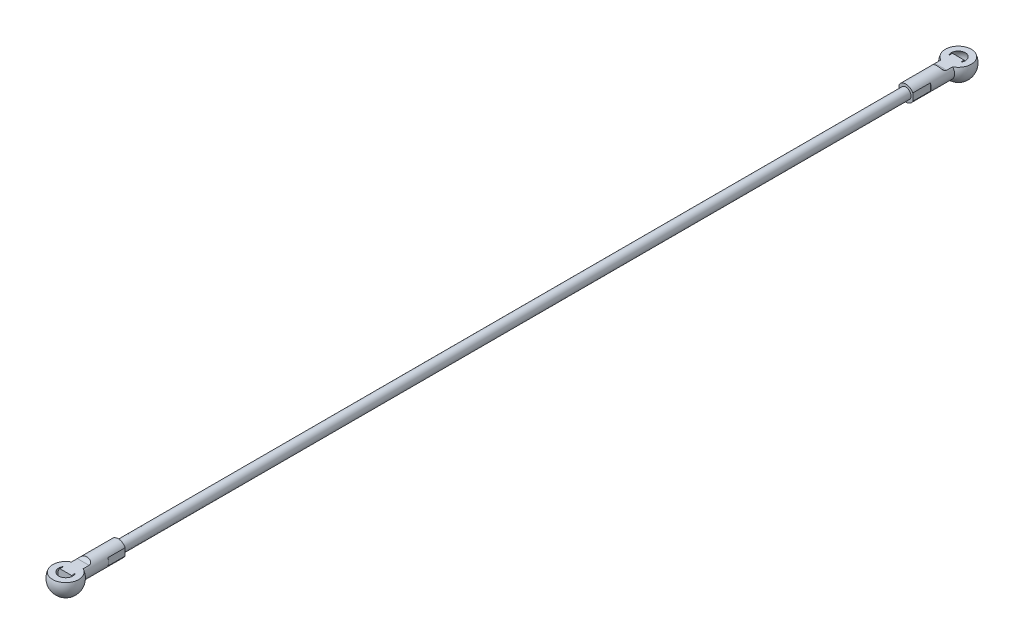
ISO-10303-21;
HEADER;
FILE_DESCRIPTION(('STEP AP214'),'2;1');
FILE_NAME('part.step','',(''),(''),'','','');
FILE_SCHEMA(('AUTOMOTIVE_DESIGN { 1 0 10303 214 1 1 1 1 }'));
ENDSEC;
DATA;
#1=APPLICATION_CONTEXT('core data for automotive mechanical design processes');
#2=APPLICATION_PROTOCOL_DEFINITION('international standard','automotive_design',2000,#1);
#3=PRODUCT_CONTEXT('',#1,'mechanical');
#4=PRODUCT('Part','Part','',(#3));
#5=PRODUCT_RELATED_PRODUCT_CATEGORY('part','',(#4));
#6=PRODUCT_DEFINITION_FORMATION('','',#4);
#7=PRODUCT_DEFINITION_CONTEXT('part definition',#1,'design');
#8=PRODUCT_DEFINITION('design','',#6,#7);
#9=PRODUCT_DEFINITION_SHAPE('','',#8);
#10=(LENGTH_UNIT() NAMED_UNIT(*) SI_UNIT(.MILLI.,.METRE.));
#11=(NAMED_UNIT(*) PLANE_ANGLE_UNIT() SI_UNIT($,.RADIAN.));
#12=(NAMED_UNIT(*) SI_UNIT($,.STERADIAN.) SOLID_ANGLE_UNIT());
#13=UNCERTAINTY_MEASURE_WITH_UNIT(LENGTH_MEASURE(1.E-05),#10,'distance_accuracy_value','');
#14=(GEOMETRIC_REPRESENTATION_CONTEXT(3) GLOBAL_UNCERTAINTY_ASSIGNED_CONTEXT((#13)) GLOBAL_UNIT_ASSIGNED_CONTEXT((#10,
#11,#12)) REPRESENTATION_CONTEXT('',''));
#15=CARTESIAN_POINT('',(0.,0.,0.));
#16=DIRECTION('',(0.,0.,1.));
#17=DIRECTION('',(1.,0.,0.));
#18=AXIS2_PLACEMENT_3D('',#15,#16,#17);
#19=CARTESIAN_POINT('',(0.,0.,480.));
#20=DIRECTION('',(0.,0.,1.));
#21=DIRECTION('',(1.,0.,0.));
#22=AXIS2_PLACEMENT_3D('',#19,#20,#21);
#23=CYLINDRICAL_SURFACE('',#22,4.5);
#24=DIRECTION('',(0.,0.,1.));
#25=VECTOR('',#24,1.);
#26=CARTESIAN_POINT('',(3.35410196625167,2.99999999999778,480.));
#27=LINE('',#26,#25);
#28=CARTESIAN_POINT('',(3.35410196625167,2.99999999999778,510.));
#29=VERTEX_POINT('',#28);
#30=CARTESIAN_POINT('',(3.35410196625167,2.99999999999778,507.82055052823));
#31=VERTEX_POINT('',#30);
#32=EDGE_CURVE('E268',#29,#31,#27,.F.);
#33=ORIENTED_EDGE('',*,*,#32,.F.);
#34=CARTESIAN_POINT('',(0.,0.,510.));
#35=DIRECTION('',(0.,0.,1.));
#36=DIRECTION('',(1.,0.,0.));
#37=AXIS2_PLACEMENT_3D('',#34,#35,#36);
#38=CIRCLE('',#37,4.5);
#39=CARTESIAN_POINT('',(-3.35410196625167,2.99999999999778,510.));
#40=VERTEX_POINT('',#39);
#41=EDGE_CURVE('E267',#40,#29,#38,.T.);
#42=ORIENTED_EDGE('',*,*,#41,.F.);
#43=DIRECTION('',(0.,0.,1.));
#44=VECTOR('',#43,1.);
#45=CARTESIAN_POINT('',(-3.35410196625167,2.99999999999778,480.));
#46=LINE('',#45,#44);
#47=CARTESIAN_POINT('',(-3.35410196625167,2.99999999999778,507.820550528229));
#48=VERTEX_POINT('',#47);
#49=EDGE_CURVE('E271',#48,#40,#46,.T.);
#50=ORIENTED_EDGE('',*,*,#49,.F.);
#51=CARTESIAN_POINT('',(0.,0.,507.82055052823));
#52=DIRECTION('',(0.,0.,0.99999999999998));
#53=DIRECTION('',(1.,0.,0.));
#54=AXIS2_PLACEMENT_3D('',#51,#52,#53);
#55=CIRCLE('',#54,4.5);
#56=EDGE_CURVE('E287',#31,#48,#55,.F.);
#57=ORIENTED_EDGE('',*,*,#56,.F.);
#58=EDGE_LOOP('',(#33,#42,#50,#57));
#59=FACE_BOUND('',#58,.T.);
#60=ADVANCED_FACE('F31',(#59),#23,.T.);
#61=CARTESIAN_POINT('',(0.,0.,510.));
#62=DIRECTION('',(0.,0.,-1.));
#63=DIRECTION('',(-1.,0.,0.));
#64=AXIS2_PLACEMENT_3D('',#61,#62,#63);
#65=CYLINDRICAL_SURFACE('',#64,3.);
#66=CARTESIAN_POINT('',(0.,0.,30.));
#67=DIRECTION('',(0.,0.,1.));
#68=DIRECTION('',(1.,0.,0.));
#69=AXIS2_PLACEMENT_3D('',#66,#67,#68);
#70=CIRCLE('',#69,3.);
#71=CARTESIAN_POINT('',(3.,0.,30.));
#72=VERTEX_POINT('',#71);
#73=EDGE_CURVE('E176',#72,#72,#70,.T.);
#74=ORIENTED_EDGE('',*,*,#73,.T.);
#75=EDGE_LOOP('',(#74));
#76=FACE_BOUND('',#75,.T.);
#77=CARTESIAN_POINT('',(0.,0.,480.));
#78=DIRECTION('',(0.,0.,1.));
#79=DIRECTION('',(1.,0.,0.));
#80=AXIS2_PLACEMENT_3D('',#77,#78,#79);
#81=CIRCLE('',#80,3.);
#82=CARTESIAN_POINT('',(3.,0.,480.));
#83=VERTEX_POINT('',#82);
#84=EDGE_CURVE('E198',#83,#83,#81,.T.);
#85=ORIENTED_EDGE('',*,*,#84,.F.);
#86=EDGE_LOOP('',(#85));
#87=FACE_BOUND('',#86,.T.);
#88=ADVANCED_FACE('F224',(#76,#87),#65,.T.);
#89=CARTESIAN_POINT('',(0.,0.,30.));
#90=DIRECTION('',(0.,0.,-1.));
#91=DIRECTION('',(-1.,0.,0.));
#92=AXIS2_PLACEMENT_3D('',#89,#90,#91);
#93=CYLINDRICAL_SURFACE('',#92,4.5);
#94=CARTESIAN_POINT('',(0.,0.,2.17944947177034));
#95=DIRECTION('',(0.,0.,-1.));
#96=DIRECTION('',(-1.,0.,0.));
#97=AXIS2_PLACEMENT_3D('',#94,#95,#96);
#98=CIRCLE('',#97,4.5);
#99=CARTESIAN_POINT('',(3.35410196624977,2.9999999999999,2.17944947177034));
#100=VERTEX_POINT('',#99);
#101=CARTESIAN_POINT('',(-3.35410196624977,2.9999999999999,2.17944947177034));
#102=VERTEX_POINT('',#101);
#103=EDGE_CURVE('E173',#100,#102,#98,.T.);
#104=ORIENTED_EDGE('',*,*,#103,.T.);
#105=DIRECTION('',(0.,0.,-1.));
#106=VECTOR('',#105,1.);
#107=CARTESIAN_POINT('',(-3.35410196624978,2.9999999999999,30.));
#108=LINE('',#107,#106);
#109=CARTESIAN_POINT('',(-3.35410196624978,2.9999999999999,0.));
#110=VERTEX_POINT('',#109);
#111=EDGE_CURVE('E293',#102,#110,#108,.T.);
#112=ORIENTED_EDGE('',*,*,#111,.T.);
#113=CARTESIAN_POINT('',(0.,0.,0.));
#114=DIRECTION('',(0.,0.,1.));
#115=DIRECTION('',(1.,0.,0.));
#116=AXIS2_PLACEMENT_3D('',#113,#114,#115);
#117=CIRCLE('',#116,4.5);
#118=CARTESIAN_POINT('',(3.35410196624977,2.9999999999999,0.));
#119=VERTEX_POINT('',#118);
#120=EDGE_CURVE('E162',#110,#119,#117,.T.);
#121=ORIENTED_EDGE('',*,*,#120,.T.);
#122=DIRECTION('',(0.,0.,-1.));
#123=VECTOR('',#122,1.);
#124=CARTESIAN_POINT('',(3.35410196624978,2.9999999999999,30.));
#125=LINE('',#124,#123);
#126=EDGE_CURVE('E297',#119,#100,#125,.F.);
#127=ORIENTED_EDGE('',*,*,#126,.T.);
#128=EDGE_LOOP('',(#104,#112,#121,#127));
#129=FACE_BOUND('',#128,.T.);
#130=ADVANCED_FACE('F219',(#129),#93,.T.);
#131=CARTESIAN_POINT('',(0.,0.,30.));
#132=DIRECTION('',(0.,0.,1.));
#133=DIRECTION('',(1.,0.,0.));
#134=AXIS2_PLACEMENT_3D('',#131,#132,#133);
#135=PLANE('',#134);
#136=DIRECTION('',(0.,1.,0.));
#137=VECTOR('',#136,1.);
#138=CARTESIAN_POINT('',(-4.00000000000349,0.,30.));
#139=LINE('',#138,#137);
#140=CARTESIAN_POINT('',(-4.00000000000349,-2.06155281280207,30.));
#141=VERTEX_POINT('',#140);
#142=CARTESIAN_POINT('',(-4.0000000000035,2.06155281280204,30.));
#143=VERTEX_POINT('',#142);
#144=EDGE_CURVE('E46',#141,#143,#139,.T.);
#145=ORIENTED_EDGE('',*,*,#144,.F.);
#146=CARTESIAN_POINT('',(0.,0.,30.));
#147=DIRECTION('',(0.,0.,1.));
#148=DIRECTION('',(1.,0.,0.));
#149=AXIS2_PLACEMENT_3D('',#146,#147,#148);
#150=CIRCLE('',#149,4.5);
#151=CARTESIAN_POINT('',(3.99999999999652,-2.06155281281559,30.));
#152=VERTEX_POINT('',#151);
#153=EDGE_CURVE('E155',#141,#152,#150,.T.);
#154=ORIENTED_EDGE('',*,*,#153,.T.);
#155=DIRECTION('',(0.,-1.,0.));
#156=VECTOR('',#155,1.);
#157=CARTESIAN_POINT('',(3.99999999999651,0.,30.));
#158=LINE('',#157,#156);
#159=CARTESIAN_POINT('',(3.9999999999965,2.06155281281562,30.));
#160=VERTEX_POINT('',#159);
#161=EDGE_CURVE('E533',#160,#152,#158,.T.);
#162=ORIENTED_EDGE('',*,*,#161,.F.);
#163=EDGE_CURVE('E161',#160,#143,#150,.T.);
#164=ORIENTED_EDGE('',*,*,#163,.T.);
#165=EDGE_LOOP('',(#145,#154,#162,#164));
#166=FACE_BOUND('',#165,.T.);
#167=ORIENTED_EDGE('',*,*,#73,.F.);
#168=EDGE_LOOP('',(#167));
#169=FACE_BOUND('',#168,.T.);
#170=ADVANCED_FACE('F217',(#166,#169),#135,.T.);
#171=ORIENTED_EDGE('',*,*,#153,.F.);
#172=DIRECTION('',(0.,0.,-1.));
#173=VECTOR('',#172,1.);
#174=CARTESIAN_POINT('',(-4.00000000000349,-2.06155281280207,30.));
#175=LINE('',#174,#173);
#176=CARTESIAN_POINT('',(-4.00000000000349,-2.06155281280207,20.));
#177=VERTEX_POINT('',#176);
#178=EDGE_CURVE('E11',#141,#177,#175,.T.);
#179=ORIENTED_EDGE('',*,*,#178,.T.);
#180=CARTESIAN_POINT('',(0.,0.,20.));
#181=DIRECTION('',(0.,0.,-1.));
#182=DIRECTION('',(-1.,0.,0.));
#183=AXIS2_PLACEMENT_3D('',#180,#181,#182);
#184=CIRCLE('',#183,4.5);
#185=CARTESIAN_POINT('',(-4.0000000000035,2.06155281280204,20.));
#186=VERTEX_POINT('',#185);
#187=EDGE_CURVE('E39',#177,#186,#184,.T.);
#188=ORIENTED_EDGE('',*,*,#187,.T.);
#189=DIRECTION('',(0.,0.,-1.));
#190=VECTOR('',#189,1.);
#191=CARTESIAN_POINT('',(-4.0000000000035,2.06155281280204,30.));
#192=LINE('',#191,#190);
#193=EDGE_CURVE('E148',#186,#143,#192,.F.);
#194=ORIENTED_EDGE('',*,*,#193,.T.);
#195=ORIENTED_EDGE('',*,*,#163,.F.);
#196=DIRECTION('',(0.,0.,-1.));
#197=VECTOR('',#196,1.);
#198=CARTESIAN_POINT('',(3.9999999999965,2.06155281281562,30.));
#199=LINE('',#198,#197);
#200=CARTESIAN_POINT('',(3.9999999999965,2.06155281281562,20.));
#201=VERTEX_POINT('',#200);
#202=EDGE_CURVE('E529',#160,#201,#199,.T.);
#203=ORIENTED_EDGE('',*,*,#202,.T.);
#204=CARTESIAN_POINT('',(0.,0.,20.));
#205=DIRECTION('',(0.,0.,-1.));
#206=DIRECTION('',(-1.,0.,0.));
#207=AXIS2_PLACEMENT_3D('',#204,#205,#206);
#208=CIRCLE('',#207,4.5);
#209=CARTESIAN_POINT('',(3.99999999999651,-2.06155281281559,20.));
#210=VERTEX_POINT('',#209);
#211=EDGE_CURVE('E526',#201,#210,#208,.T.);
#212=ORIENTED_EDGE('',*,*,#211,.T.);
#213=DIRECTION('',(0.,0.,-1.));
#214=VECTOR('',#213,1.);
#215=CARTESIAN_POINT('',(3.99999999999652,-2.06155281281559,30.));
#216=LINE('',#215,#214);
#217=EDGE_CURVE('E157',#210,#152,#216,.F.);
#218=ORIENTED_EDGE('',*,*,#217,.T.);
#219=EDGE_LOOP('',(#171,#179,#188,#194,#195,#203,#212,#218));
#220=FACE_BOUND('',#219,.T.);
#221=CARTESIAN_POINT('',(0.,0.,6.61437827766148));
#222=DIRECTION('',(0.,0.,-1.));
#223=DIRECTION('',(-1.,0.,0.));
#224=AXIS2_PLACEMENT_3D('',#221,#222,#223);
#225=CIRCLE('',#224,4.5);
#226=CARTESIAN_POINT('',(-3.35410196624978,2.9999999999999,6.61437827766148));
#227=VERTEX_POINT('',#226);
#228=CARTESIAN_POINT('',(3.35410196624978,2.9999999999999,6.61437827766148));
#229=VERTEX_POINT('',#228);
#230=EDGE_CURVE('E165',#227,#229,#225,.F.);
#231=ORIENTED_EDGE('',*,*,#230,.T.);
#232=CARTESIAN_POINT('',(3.35410196624978,2.9999999999999,10.));
#233=VERTEX_POINT('',#232);
#234=EDGE_CURVE('E294',#229,#233,#125,.F.);
#235=ORIENTED_EDGE('',*,*,#234,.T.);
#236=CARTESIAN_POINT('',(3.35410196624978,2.9999999999999,10.));
#237=CARTESIAN_POINT('',(3.3541021640026,2.99999040636756,10.0484138177435));
#238=CARTESIAN_POINT('',(3.35268754926771,3.00158112662127,10.0968242421318));
#239=CARTESIAN_POINT('',(3.34703186223586,3.00789138050048,10.1932653398277));
#240=CARTESIAN_POINT('',(3.34279134827678,3.01261029605982,10.2412960862552));
#241=CARTESIAN_POINT('',(3.33150583822766,3.02508438754317,10.3364656524063));
#242=CARTESIAN_POINT('',(3.32447022228101,3.0328294066788,10.3836069084652));
#243=CARTESIAN_POINT('',(3.30761034555434,3.05120768588186,10.4768019709231));
#244=CARTESIAN_POINT('',(3.29778605955985,3.06184097206424,10.5228557674853));
#245=CARTESIAN_POINT('',(3.26414765734566,3.09781066225196,10.6588810483655));
#246=CARTESIAN_POINT('',(3.23615664718959,3.12723006526637,10.7468132304521));
#247=CARTESIAN_POINT('',(3.16938535707597,3.19487651580713,10.9147620590523));
#248=CARTESIAN_POINT('',(3.13060253544577,3.23310563782149,10.9947768348439));
#249=CARTESIAN_POINT('',(3.0419629397963,3.31666050975665,11.1469482648602));
#250=CARTESIAN_POINT('',(2.99189545757562,3.36211566931461,11.2189102123551));
#251=CARTESIAN_POINT('',(2.88213364142692,3.45666590301036,11.3523255296272));
#252=CARTESIAN_POINT('',(2.82243495575803,3.50576261709655,11.4137741230913));
#253=CARTESIAN_POINT('',(2.71376317083327,3.5900867283649,11.5094616113597));
#254=CARTESIAN_POINT('',(2.66689779873349,3.62508566773143,11.5463511796514));
#255=CARTESIAN_POINT('',(2.5694795856118,3.69477443246895,11.6152716814067));
#256=CARTESIAN_POINT('',(2.51892556407466,3.7294641548569,11.6473010492223));
#257=CARTESIAN_POINT('',(2.41450867606018,3.7979010291303,11.7068675366176));
#258=CARTESIAN_POINT('',(2.36064061746169,3.83164657492453,11.7343973466109));
#259=CARTESIAN_POINT('',(2.25007564291884,3.8976027785529,11.7853187052812));
#260=CARTESIAN_POINT('',(2.19337794554392,3.92981300754017,11.8087091026237));
#261=CARTESIAN_POINT('',(2.05590819599097,4.00392290885334,11.8598232709441));
#262=CARTESIAN_POINT('',(1.97405173753078,4.04494983313734,11.885904047289));
#263=CARTESIAN_POINT('',(1.80660543332715,4.12246293741629,11.9321763210987));
#264=CARTESIAN_POINT('',(1.72101417409806,4.15894737776119,11.9523655662178));
#265=CARTESIAN_POINT('',(1.54679179586606,4.2268408469279,11.9878761959215));
#266=CARTESIAN_POINT('',(1.45815829811502,4.25824578917234,12.0031936705304));
#267=CARTESIAN_POINT('',(1.2785667080779,4.31557111114158,12.0298138230132));
#268=CARTESIAN_POINT('',(1.18760882007304,4.34149197099487,12.0411168524084));
#269=CARTESIAN_POINT('',(1.00110700389637,4.38831509697869,12.0607243937986));
#270=CARTESIAN_POINT('',(0.905507878929943,4.40903974782216,12.0689266931353));
#271=CARTESIAN_POINT('',(0.712967737731185,4.44423855336881,12.0824363633519));
#272=CARTESIAN_POINT('',(0.616026698574474,4.45871260115445,12.0877436847133));
#273=CARTESIAN_POINT('',(0.421288867377538,4.48130845121629,12.095881102925));
#274=CARTESIAN_POINT('',(0.323491935262741,4.48942919328735,12.0987107863299));
#275=CARTESIAN_POINT('',(0.127535496452302,4.49926227188789,12.1021228509023));
#276=CARTESIAN_POINT('',(0.0293759663926663,4.50097418799184,12.1027050846348));
#277=CARTESIAN_POINT('',(-0.186068078071621,4.49768214257211,12.1015739774135));
#278=CARTESIAN_POINT('',(-0.303331928490269,4.49129676679949,12.0993885631589));
#279=CARTESIAN_POINT('',(-0.536916278694461,4.46939421945725,12.0916223666848));
#280=CARTESIAN_POINT('',(-0.65323656390169,4.45387502667375,12.0860408329318));
#281=CARTESIAN_POINT('',(-0.884055451960596,4.41386049362955,12.0708423049253));
#282=CARTESIAN_POINT('',(-0.998554153957739,4.38936564365362,12.0612255310879));
#283=CARTESIAN_POINT('',(-1.22477813691618,4.331688967685,12.0369412977813));
#284=CARTESIAN_POINT('',(-1.33650443958426,4.29851039554694,12.022275729485));
#285=CARTESIAN_POINT('',(-1.52575555788518,4.23427870593875,11.991441503395));
#286=CARTESIAN_POINT('',(-1.60419707829879,4.20517346455283,11.9768090657083));
#287=CARTESIAN_POINT('',(-1.75859872102303,4.14297629537276,11.9435166568281));
#288=CARTESIAN_POINT('',(-1.83455943937573,4.10988533428648,11.9248576613818));
#289=CARTESIAN_POINT('',(-1.98335924265145,4.04017582927849,11.8828109241952));
#290=CARTESIAN_POINT('',(-2.05620306879835,4.0035629398713,11.8594306982468));
#291=CARTESIAN_POINT('',(-2.19823990761171,3.92737111326949,11.8071531709541));
#292=CARTESIAN_POINT('',(-2.26743401853738,3.88779307711347,11.7782575415137));
#293=CARTESIAN_POINT('',(-2.43441913894269,3.78645066059279,11.6983906901546));
#294=CARTESIAN_POINT('',(-2.52959868022167,3.7233220793691,11.6435419320866));
#295=CARTESIAN_POINT('',(-2.70759654258319,3.59595290045018,11.5175021647297));
#296=CARTESIAN_POINT('',(-2.79043024879698,3.53171380004024,11.4463317808691));
#297=CARTESIAN_POINT('',(-2.92860314462472,3.41759590567903,11.2998610673041));
#298=CARTESIAN_POINT('',(-2.98622385794538,3.3671026381278,11.227204148694));
#299=CARTESIAN_POINT('',(-3.0897152675626,3.27239762536155,11.0702501916417));
#300=CARTESIAN_POINT('',(-3.13558753860289,3.22818503864759,10.9859547155481));
#301=CARTESIAN_POINT('',(-3.21483759727326,3.14928318271044,10.8069339707016));
#302=CARTESIAN_POINT('',(-3.24814829452393,3.114645306534,10.7121560997999));
#303=CARTESIAN_POINT('',(-3.30141403673419,3.05813633622311,10.5153383741937));
#304=CARTESIAN_POINT('',(-3.32138453304481,3.03625047577422,10.4133070729618));
#305=CARTESIAN_POINT('',(-3.34111517729927,3.01447033396333,10.258479785806));
#306=CARTESIAN_POINT('',(-3.34598849755002,3.00905233797917,10.2070148497101));
#307=CARTESIAN_POINT('',(-3.35247733237427,3.00181744608179,10.1037099826249));
#308=CARTESIAN_POINT('',(-3.35409793620925,2.99999492469766,10.0518707650036));
#309=CARTESIAN_POINT('',(-3.35410196624978,2.9999999999999,10.));
#310=B_SPLINE_CURVE_WITH_KNOTS('',3,(#236,#237,#238,#239,#240,#241,#242,#243,#244,#245,#246,
#247,#248,#249,#250,#251,#252,#253,#254,#255,#256,#257,#258,#259,#260,#261,#262,#263,#264,#265,
#266,#267,#268,#269,#270,#271,#272,#273,#274,#275,#276,#277,#278,#279,#280,#281,#282,#283,#284,
#285,#286,#287,#288,#289,#290,#291,#292,#293,#294,#295,#296,#297,#298,#299,#300,#301,#302,#303,
#304,#305,#306,#307,#308,#309),.UNSPECIFIED.,.F.,.F.,(4,2,2,2,2,2,2,2,2,2,2,2,2,2,2,2,2,2,2,2,2,
2,2,2,2,2,2,2,2,2,2,2,2,2,2,2,4),(0.,0.145188867437176,0.2903490571284,0.435026160847226,
0.579704572742644,0.868770198330935,1.15790396196576,1.45296468295413,1.7481590988256,
1.9553562522896,2.16262001046486,2.37021719462777,2.57787202934706,2.86306218046686,
3.14836121801727,3.4338886558536,3.71939108556194,4.01362016529215,4.30785427765732,
4.60213747974609,4.89643998677576,5.24839938068712,5.60043668866593,5.95245476988483,
6.30434113571163,6.55895288017658,6.81350299426452,7.06765103653584,7.32172216000169,
7.7003557610128,8.07851349874405,8.3939424447989,8.70932908907367,9.02637710274254,
9.34305725434646,9.49879418978199,9.65428726572478),.UNSPECIFIED.);
#311=CARTESIAN_POINT('',(-3.35410196624978,2.9999999999999,10.));
#312=VERTEX_POINT('',#311);
#313=EDGE_CURVE('E188',#233,#312,#310,.T.);
#314=ORIENTED_EDGE('',*,*,#313,.T.);
#315=EDGE_CURVE('E167',#312,#227,#108,.T.);
#316=ORIENTED_EDGE('',*,*,#315,.T.);
#317=EDGE_LOOP('',(#231,#235,#314,#316));
#318=FACE_BOUND('',#317,.T.);
#319=ADVANCED_FACE('F152',(#220,#318),#93,.T.);
#320=CARTESIAN_POINT('',(0.,0.,0.));
#321=DIRECTION('',(0.,0.,1.));
#322=DIRECTION('',(1.,0.,0.));
#323=AXIS2_PLACEMENT_3D('',#320,#321,#322);
#324=PLANE('',#323);
#325=ORIENTED_EDGE('',*,*,#120,.F.);
#326=DIRECTION('',(1.,0.,0.));
#327=VECTOR('',#326,1.);
#328=CARTESIAN_POINT('',(0.,2.9999999999999,0.));
#329=LINE('',#328,#327);
#330=EDGE_CURVE('E299',#110,#119,#329,.T.);
#331=ORIENTED_EDGE('',*,*,#330,.T.);
#332=EDGE_LOOP('',(#325,#331));
#333=FACE_BOUND('',#332,.T.);
#334=ADVANCED_FACE('F213',(#333),#324,.F.);
#335=CARTESIAN_POINT('',(-7.41619848709566,2.99999999999999,0.));
#336=DIRECTION('',(0.,-1.,0.));
#337=DIRECTION('',(1.,0.,0.));
#338=AXIS2_PLACEMENT_3D('',#335,#336,#337);
#339=PLANE('',#338);
#340=CARTESIAN_POINT('',(0.,2.99999999999989,0.));
#341=DIRECTION('',(0.,-1.,0.));
#342=DIRECTION('',(1.,0.,0.));
#343=AXIS2_PLACEMENT_3D('',#340,#341,#342);
#344=CIRCLE('',#343,7.41619848709565);
#345=EDGE_CURVE('E183',#227,#229,#344,.T.);
#346=ORIENTED_EDGE('',*,*,#345,.F.);
#347=ORIENTED_EDGE('',*,*,#315,.F.);
#348=DIRECTION('',(1.,0.,0.));
#349=VECTOR('',#348,1.);
#350=CARTESIAN_POINT('',(-8.,2.9999999999999,10.));
#351=LINE('',#350,#349);
#352=EDGE_CURVE('E290',#312,#233,#351,.T.);
#353=ORIENTED_EDGE('',*,*,#352,.T.);
#354=ORIENTED_EDGE('',*,*,#234,.F.);
#355=EDGE_LOOP('',(#346,#347,#353,#354));
#356=FACE_BOUND('',#355,.T.);
#357=ORIENTED_EDGE('',*,*,#111,.F.);
#358=CARTESIAN_POINT('',(0.,2.99999999999989,0.));
#359=DIRECTION('',(0.,-1.,0.));
#360=DIRECTION('',(1.,0.,0.));
#361=AXIS2_PLACEMENT_3D('',#358,#359,#360);
#362=CIRCLE('',#361,3.99999999999999);
#363=EDGE_CURVE('E185',#102,#100,#362,.T.);
#364=ORIENTED_EDGE('',*,*,#363,.T.);
#365=ORIENTED_EDGE('',*,*,#126,.F.);
#366=ORIENTED_EDGE('',*,*,#330,.F.);
#367=EDGE_LOOP('',(#357,#364,#365,#366));
#368=FACE_BOUND('',#367,.T.);
#369=ADVANCED_FACE('F215',(#356,#368),#339,.F.);
#370=CARTESIAN_POINT('',(0.,0.,0.));
#371=DIRECTION('',(0.,-1.,0.));
#372=DIRECTION('',(-1.,0.,0.));
#373=AXIS2_PLACEMENT_3D('',#370,#371,#372);
#374=SPHERICAL_SURFACE('',#373,8.);
#375=ORIENTED_EDGE('',*,*,#230,.F.);
#376=ORIENTED_EDGE('',*,*,#345,.T.);
#377=EDGE_LOOP('',(#375,#376));
#378=FACE_BOUND('',#377,.T.);
#379=ADVANCED_FACE('F307',(#378),#374,.T.);
#380=CARTESIAN_POINT('',(0.,0.,0.));
#381=DIRECTION('',(0.,-1.,0.));
#382=DIRECTION('',(1.,0.,0.));
#383=AXIS2_PLACEMENT_3D('',#380,#381,#382);
#384=SPHERICAL_SURFACE('',#383,5.);
#385=ORIENTED_EDGE('',*,*,#103,.F.);
#386=ORIENTED_EDGE('',*,*,#363,.F.);
#387=EDGE_LOOP('',(#385,#386));
#388=FACE_BOUND('',#387,.T.);
#389=ADVANCED_FACE('F33',(#388),#384,.F.);
#390=CARTESIAN_POINT('',(-8.,5.22332082715479,10.));
#391=DIRECTION('',(1.,0.,0.));
#392=DIRECTION('',(0.,0.,-1.));
#393=AXIS2_PLACEMENT_3D('',#390,#391,#392);
#394=CYLINDRICAL_SURFACE('',#393,2.22332082715489);
#395=ORIENTED_EDGE('',*,*,#352,.F.);
#396=ORIENTED_EDGE('',*,*,#313,.F.);
#397=EDGE_LOOP('',(#395,#396));
#398=FACE_BOUND('',#397,.T.);
#399=ADVANCED_FACE('F203',(#398),#394,.F.);
#400=CARTESIAN_POINT('',(0.,0.,480.));
#401=DIRECTION('',(0.,0.,1.));
#402=DIRECTION('',(1.,0.,0.));
#403=AXIS2_PLACEMENT_3D('',#400,#401,#402);
#404=PLANE('',#403);
#405=CARTESIAN_POINT('',(0.,0.,480.));
#406=DIRECTION('',(0.,0.,1.));
#407=DIRECTION('',(1.,0.,0.));
#408=AXIS2_PLACEMENT_3D('',#405,#406,#407);
#409=CIRCLE('',#408,4.5);
#410=CARTESIAN_POINT('',(-4.00000000000349,-2.06155281280207,480.));
#411=VERTEX_POINT('',#410);
#412=CARTESIAN_POINT('',(3.99999999999652,-2.06155281281559,480.));
#413=VERTEX_POINT('',#412);
#414=EDGE_CURVE('E282',#411,#413,#409,.T.);
#415=ORIENTED_EDGE('',*,*,#414,.F.);
#416=DIRECTION('',(0.,1.,0.));
#417=VECTOR('',#416,1.);
#418=CARTESIAN_POINT('',(-4.00000000000349,0.,480.));
#419=LINE('',#418,#417);
#420=CARTESIAN_POINT('',(-4.0000000000035,2.06155281280204,480.));
#421=VERTEX_POINT('',#420);
#422=EDGE_CURVE('E537',#411,#421,#419,.T.);
#423=ORIENTED_EDGE('',*,*,#422,.T.);
#424=CARTESIAN_POINT('',(3.9999999999965,2.06155281281562,480.));
#425=VERTEX_POINT('',#424);
#426=EDGE_CURVE('E283',#425,#421,#409,.T.);
#427=ORIENTED_EDGE('',*,*,#426,.F.);
#428=DIRECTION('',(0.,-1.,0.));
#429=VECTOR('',#428,1.);
#430=CARTESIAN_POINT('',(3.99999999999651,0.,480.));
#431=LINE('',#430,#429);
#432=EDGE_CURVE('E272',#425,#413,#431,.T.);
#433=ORIENTED_EDGE('',*,*,#432,.T.);
#434=EDGE_LOOP('',(#415,#423,#427,#433));
#435=FACE_BOUND('',#434,.T.);
#436=ORIENTED_EDGE('',*,*,#84,.T.);
#437=EDGE_LOOP('',(#436));
#438=FACE_BOUND('',#437,.T.);
#439=ADVANCED_FACE('F208',(#435,#438),#404,.F.);
#440=DIRECTION('',(0.,0.,1.));
#441=VECTOR('',#440,1.);
#442=CARTESIAN_POINT('',(-4.0000000000035,2.06155281280204,480.));
#443=LINE('',#442,#441);
#444=CARTESIAN_POINT('',(-4.0000000000035,2.06155281280204,490.));
#445=VERTEX_POINT('',#444);
#446=EDGE_CURVE('E250',#445,#421,#443,.F.);
#447=ORIENTED_EDGE('',*,*,#446,.F.);
#448=CARTESIAN_POINT('',(0.,0.,490.));
#449=DIRECTION('',(0.,0.,1.));
#450=DIRECTION('',(1.,0.,0.));
#451=AXIS2_PLACEMENT_3D('',#448,#449,#450);
#452=CIRCLE('',#451,4.5);
#453=CARTESIAN_POINT('',(-4.00000000000348,-2.06155281280207,490.));
#454=VERTEX_POINT('',#453);
#455=EDGE_CURVE('E520',#454,#445,#452,.F.);
#456=ORIENTED_EDGE('',*,*,#455,.F.);
#457=DIRECTION('',(0.,0.,1.));
#458=VECTOR('',#457,1.);
#459=CARTESIAN_POINT('',(-4.00000000000349,-2.06155281280207,480.));
#460=LINE('',#459,#458);
#461=EDGE_CURVE('E522',#411,#454,#460,.T.);
#462=ORIENTED_EDGE('',*,*,#461,.F.);
#463=ORIENTED_EDGE('',*,*,#414,.T.);
#464=DIRECTION('',(0.,0.,1.));
#465=VECTOR('',#464,1.);
#466=CARTESIAN_POINT('',(3.99999999999652,-2.06155281281559,480.));
#467=LINE('',#466,#465);
#468=CARTESIAN_POINT('',(3.99999999999652,-2.06155281281559,490.));
#469=VERTEX_POINT('',#468);
#470=EDGE_CURVE('E517',#469,#413,#467,.F.);
#471=ORIENTED_EDGE('',*,*,#470,.F.);
#472=CARTESIAN_POINT('',(0.,0.,490.));
#473=DIRECTION('',(0.,0.,1.));
#474=DIRECTION('',(1.,0.,0.));
#475=AXIS2_PLACEMENT_3D('',#472,#473,#474);
#476=CIRCLE('',#475,4.5);
#477=CARTESIAN_POINT('',(3.9999999999965,2.06155281281562,490.));
#478=VERTEX_POINT('',#477);
#479=EDGE_CURVE('E515',#478,#469,#476,.F.);
#480=ORIENTED_EDGE('',*,*,#479,.F.);
#481=DIRECTION('',(0.,0.,1.));
#482=VECTOR('',#481,1.);
#483=CARTESIAN_POINT('',(3.9999999999965,2.06155281281562,480.));
#484=LINE('',#483,#482);
#485=EDGE_CURVE('E261',#425,#478,#484,.T.);
#486=ORIENTED_EDGE('',*,*,#485,.F.);
#487=ORIENTED_EDGE('',*,*,#426,.T.);
#488=EDGE_LOOP('',(#447,#456,#462,#463,#471,#480,#486,#487));
#489=FACE_BOUND('',#488,.T.);
#490=CARTESIAN_POINT('',(3.35410196625151,2.99999999999796,499.999999999996));
#491=CARTESIAN_POINT('',(3.35410221817681,2.99999045455518,499.951887301806));
#492=CARTESIAN_POINT('',(3.35269571706674,3.00157199762233,499.903778000275));
#493=CARTESIAN_POINT('',(3.34707277008456,3.00784579657744,499.807937226065));
#494=CARTESIAN_POINT('',(3.34285688677364,3.01253742968837,499.76020567968));
#495=CARTESIAN_POINT('',(3.33163760851707,3.0249391341168,499.665631002498));
#496=CARTESIAN_POINT('',(3.32464362426697,3.03263901369883,499.618785426087));
#497=CARTESIAN_POINT('',(3.30788463204457,3.050910027045,499.526175483152));
#498=CARTESIAN_POINT('',(3.29811959755199,3.06148118828865,499.480411126979));
#499=CARTESIAN_POINT('',(3.26468694985435,3.09724019841177,499.345242830876));
#500=CARTESIAN_POINT('',(3.23687034798127,3.12648684779345,499.257866117255));
#501=CARTESIAN_POINT('',(3.17052840730683,3.1937379252173,499.090976109479));
#502=CARTESIAN_POINT('',(3.13200042650899,3.23174451353102,499.011464761912));
#503=CARTESIAN_POINT('',(3.04394311250621,3.31483646811859,498.860214485181));
#504=CARTESIAN_POINT('',(2.99420080314326,3.36005310745841,498.788672585956));
#505=CARTESIAN_POINT('',(2.88516922144166,3.45412388636924,498.656027820643));
#506=CARTESIAN_POINT('',(2.82587564389877,3.50297966090524,498.594929687767));
#507=CARTESIAN_POINT('',(2.71785837181642,3.58698316296906,498.499696381193));
#508=CARTESIAN_POINT('',(2.67121820661394,3.62189728349922,498.462939800596));
#509=CARTESIAN_POINT('',(2.57428114793239,3.69142867180959,498.3942752223));
#510=CARTESIAN_POINT('',(2.52398307526904,3.72604583980598,498.362368798461));
#511=CARTESIAN_POINT('',(2.36808986962826,3.82851614233562,498.273346284145));
#512=CARTESIAN_POINT('',(2.25759002019191,3.89491318286623,498.22300724009));
#513=CARTESIAN_POINT('',(2.06297451443235,4.00029519565952,498.150559657686));
#514=CARTESIAN_POINT('',(1.98134753714279,4.04138119837311,498.124540749084));
#515=CARTESIAN_POINT('',(1.81432757629228,4.11906305537648,498.078375265534));
#516=CARTESIAN_POINT('',(1.72893315320755,4.15565717278046,498.058230958013));
#517=CARTESIAN_POINT('',(1.55511126861219,4.22378506749546,498.022808826787));
#518=CARTESIAN_POINT('',(1.46668140561928,4.25531472059791,498.007534959416));
#519=CARTESIAN_POINT('',(1.28749159102135,4.31291328201418,497.980989871162));
#520=CARTESIAN_POINT('',(1.19673184645383,4.33898267366405,497.969718295939));
#521=CARTESIAN_POINT('',(1.01057410758272,4.3861424933948,497.950152877432));
#522=CARTESIAN_POINT('',(0.915119694016314,4.40705255708385,497.941962713049));
#523=CARTESIAN_POINT('',(0.722858707179654,4.44263821476077,497.928457050658));
#524=CARTESIAN_POINT('',(0.626052110388011,4.45731370015756,497.923141602719));
#525=CARTESIAN_POINT('',(0.431572010789487,4.48032755570507,497.914961123552));
#526=CARTESIAN_POINT('',(0.33389837581833,4.48866494234388,497.912096472616));
#527=CARTESIAN_POINT('',(0.138173586611251,4.49894586712955,497.908580880075));
#528=CARTESIAN_POINT('',(0.0401224077269604,4.50088898048237,497.907930085545));
#529=CARTESIAN_POINT('',(-0.175355492557036,4.49811591720519,497.908867422981));
#530=CARTESIAN_POINT('',(-0.292765144231463,4.49200143092483,497.910925583474));
#531=CARTESIAN_POINT('',(-0.526666596929031,4.47061713858203,497.918383120785));
#532=CARTESIAN_POINT('',(-0.643158188443893,4.45534530072665,497.923783239111));
#533=CARTESIAN_POINT('',(-0.874350179619379,4.41579714841085,497.938558535126));
#534=CARTESIAN_POINT('',(-0.989050629304696,4.39152108589928,497.947933601592));
#535=CARTESIAN_POINT('',(-1.215708892448,4.33424738803244,497.971670954963));
#536=CARTESIAN_POINT('',(-1.32766770866864,4.30125299511633,497.98603138838));
#537=CARTESIAN_POINT('',(-1.51746937062327,4.2372604866975,498.016305287673));
#538=CARTESIAN_POINT('',(-1.59621745045286,4.20821433903301,498.030702301601));
#539=CARTESIAN_POINT('',(-1.75124462843144,4.14609578404146,498.063506966268));
#540=CARTESIAN_POINT('',(-1.8275243179673,4.11302435028572,498.081913648059));
#541=CARTESIAN_POINT('',(-1.97697261676579,4.04331080138885,498.123447360877));
#542=CARTESIAN_POINT('',(-2.05014597001837,4.00667443470157,498.146566856315));
#543=CARTESIAN_POINT('',(-2.19285071816145,3.93038919732811,498.198326295543));
#544=CARTESIAN_POINT('',(-2.2623832247623,3.89074125537713,498.226964541568));
#545=CARTESIAN_POINT('',(-2.42986654695833,3.78937684737668,498.306047780952));
#546=CARTESIAN_POINT('',(-2.52524166257215,3.72628450851517,498.360332187396));
#547=CARTESIAN_POINT('',(-2.70370484289692,3.59888569284507,498.485229892686));
#548=CARTESIAN_POINT('',(-2.78680833664908,3.53458085727939,498.555822395928));
#549=CARTESIAN_POINT('',(-2.92537021376226,3.42036503039114,498.701120945837));
#550=CARTESIAN_POINT('',(-2.98312749592871,3.3698499163256,498.773146976994));
#551=CARTESIAN_POINT('',(-3.08695894722148,3.2750015174895,498.928857223522));
#552=CARTESIAN_POINT('',(-3.13303487133629,3.23066730456126,499.012539684718));
#553=CARTESIAN_POINT('',(-3.21274114849737,3.15142694715797,499.190400171226));
#554=CARTESIAN_POINT('',(-3.24630318525648,3.11657282841648,499.284632259422));
#555=CARTESIAN_POINT('',(-3.30008779149832,3.05957201448132,499.480443958552));
#556=CARTESIAN_POINT('',(-3.32032558236675,3.03741082288842,499.582015037768));
#557=CARTESIAN_POINT('',(-3.34058700452156,3.01505698063747,499.737237278837));
#558=CARTESIAN_POINT('',(-3.3456582548136,3.00942010869864,499.78953999128));
#559=CARTESIAN_POINT('',(-3.35241113939741,3.00189143118367,499.894551474204));
#560=CARTESIAN_POINT('',(-3.35409788739063,2.99999397573772,499.947259511121));
#561=CARTESIAN_POINT('',(-3.35410196625151,2.99999999999796,499.999999999996));
#562=B_SPLINE_CURVE_WITH_KNOTS('',3,(#490,#491,#492,#493,#494,#495,#496,#497,#498,#499,#500,
#501,#502,#503,#504,#505,#506,#507,#508,#509,#510,#511,#512,#513,#514,#515,#516,#517,#518,#519,
#520,#521,#522,#523,#524,#525,#526,#527,#528,#529,#530,#531,#532,#533,#534,#535,#536,#537,#538,
#539,#540,#541,#542,#543,#544,#545,#546,#547,#548,#549,#550,#551,#552,#553,#554,#555,#556,#557,
#558,#559,#560,#561),.UNSPECIFIED.,.F.,.F.,(4,2,2,2,2,2,2,2,2,2,2,2,2,2,2,2,2,2,2,2,2,2,2,2,2,2,
2,2,2,2,2,2,2,2,2,4),(0.,0.144285754006822,0.288542624373933,0.432314942232723,
0.576088636108391,0.863342596712623,1.15066747239665,1.44399368403606,1.73745248343069,
1.94384268627027,2.15029971972091,2.56364245275081,2.8483721054642,3.13321151061445,
3.41828170932931,3.70332666328408,3.99724964340383,4.29117774273165,4.58515144292849,
4.87914467243694,5.23149071331844,5.58391496013409,5.9363293464465,6.28861285015209,
6.5438932092958,6.79911194757693,7.05392575858181,7.3086613045097,7.68696183711613,
8.06478260904866,8.37917651001101,8.69352314890992,9.00956159150848,9.32523836796055,
9.48357461652976,9.6416714515099),.UNSPECIFIED.);
#563=CARTESIAN_POINT('',(3.35410196625167,2.99999999999778,499.999999999996));
#564=VERTEX_POINT('',#563);
#565=CARTESIAN_POINT('',(-3.35410196625167,2.99999999999778,499.999999999996));
#566=VERTEX_POINT('',#565);
#567=EDGE_CURVE('E252',#564,#566,#562,.T.);
#568=ORIENTED_EDGE('',*,*,#567,.F.);
#569=CARTESIAN_POINT('',(3.35410196625147,2.99999999999778,503.385621722338));
#570=VERTEX_POINT('',#569);
#571=EDGE_CURVE('E255',#570,#564,#27,.F.);
#572=ORIENTED_EDGE('',*,*,#571,.F.);
#573=CARTESIAN_POINT('',(0.,0.,503.385621722339));
#574=DIRECTION('',(0.,0.,0.999999999999992));
#575=DIRECTION('',(1.,0.,0.));
#576=AXIS2_PLACEMENT_3D('',#573,#574,#575);
#577=CIRCLE('',#576,4.5);
#578=CARTESIAN_POINT('',(-3.35410196625167,2.99999999999778,503.385621722339));
#579=VERTEX_POINT('',#578);
#580=EDGE_CURVE('E285',#579,#570,#577,.T.);
#581=ORIENTED_EDGE('',*,*,#580,.F.);
#582=EDGE_CURVE('E257',#566,#579,#46,.T.);
#583=ORIENTED_EDGE('',*,*,#582,.F.);
#584=EDGE_LOOP('',(#568,#572,#581,#583));
#585=FACE_BOUND('',#584,.T.);
#586=ADVANCED_FACE('F210',(#489,#585),#23,.T.);
#587=CARTESIAN_POINT('',(-4.00000000000323,2.99999999999688,510.));
#588=DIRECTION('',(0.,-1.,0.));
#589=DIRECTION('',(1.,0.,0.));
#590=AXIS2_PLACEMENT_3D('',#587,#588,#589);
#591=PLANE('',#590);
#592=ORIENTED_EDGE('',*,*,#32,.T.);
#593=CARTESIAN_POINT('',(0.,2.99999999999567,510.));
#594=DIRECTION('',(0.,-1.,0.));
#595=DIRECTION('',(1.,0.,0.));
#596=AXIS2_PLACEMENT_3D('',#593,#594,#595);
#597=CIRCLE('',#596,4.00000000000322);
#598=EDGE_CURVE('E180',#31,#48,#597,.T.);
#599=ORIENTED_EDGE('',*,*,#598,.T.);
#600=ORIENTED_EDGE('',*,*,#49,.T.);
#601=DIRECTION('',(1.,0.,0.));
#602=VECTOR('',#601,1.);
#603=CARTESIAN_POINT('',(0.,2.99999999999778,510.));
#604=LINE('',#603,#602);
#605=EDGE_CURVE('E262',#40,#29,#604,.T.);
#606=ORIENTED_EDGE('',*,*,#605,.T.);
#607=EDGE_LOOP('',(#592,#599,#600,#606));
#608=FACE_BOUND('',#607,.T.);
#609=CARTESIAN_POINT('',(0.,2.99999999999812,510.));
#610=DIRECTION('',(0.,-1.,0.));
#611=DIRECTION('',(1.,0.,0.));
#612=AXIS2_PLACEMENT_3D('',#609,#610,#611);
#613=CIRCLE('',#612,7.41619848709644);
#614=EDGE_CURVE('E177',#570,#579,#613,.T.);
#615=ORIENTED_EDGE('',*,*,#614,.F.);
#616=ORIENTED_EDGE('',*,*,#571,.T.);
#617=DIRECTION('',(1.,0.,0.));
#618=VECTOR('',#617,1.);
#619=CARTESIAN_POINT('',(-30.,2.99999999999778,499.999999999996));
#620=LINE('',#619,#618);
#621=EDGE_CURVE('E266',#566,#564,#620,.T.);
#622=ORIENTED_EDGE('',*,*,#621,.F.);
#623=ORIENTED_EDGE('',*,*,#582,.T.);
#624=EDGE_LOOP('',(#615,#616,#622,#623));
#625=FACE_BOUND('',#624,.T.);
#626=ADVANCED_FACE('F236',(#608,#625),#591,.F.);
#627=CARTESIAN_POINT('',(0.,0.,510.));
#628=DIRECTION('',(0.,-1.,0.));
#629=DIRECTION('',(-1.,0.,0.));
#630=AXIS2_PLACEMENT_3D('',#627,#628,#629);
#631=SPHERICAL_SURFACE('',#630,8.);
#632=ORIENTED_EDGE('',*,*,#614,.T.);
#633=ORIENTED_EDGE('',*,*,#580,.T.);
#634=EDGE_LOOP('',(#632,#633));
#635=FACE_BOUND('',#634,.T.);
#636=ADVANCED_FACE('F242',(#635),#631,.T.);
#637=CARTESIAN_POINT('',(0.,0.,510.));
#638=DIRECTION('',(0.,-1.,0.));
#639=DIRECTION('',(1.,0.,0.));
#640=AXIS2_PLACEMENT_3D('',#637,#638,#639);
#641=SPHERICAL_SURFACE('',#640,5.);
#642=ORIENTED_EDGE('',*,*,#598,.F.);
#643=ORIENTED_EDGE('',*,*,#56,.T.);
#644=EDGE_LOOP('',(#642,#643));
#645=FACE_BOUND('',#644,.T.);
#646=ADVANCED_FACE('F322',(#645),#641,.F.);
#647=CARTESIAN_POINT('',(0.,0.,510.));
#648=DIRECTION('',(0.,0.,1.));
#649=DIRECTION('',(1.,0.,0.));
#650=AXIS2_PLACEMENT_3D('',#647,#648,#649);
#651=PLANE('',#650);
#652=ORIENTED_EDGE('',*,*,#605,.F.);
#653=ORIENTED_EDGE('',*,*,#41,.T.);
#654=EDGE_LOOP('',(#652,#653));
#655=FACE_BOUND('',#654,.T.);
#656=ADVANCED_FACE('F319',(#655),#651,.T.);
#657=CARTESIAN_POINT('',(-30.,5.20850018814006,499.999999999996));
#658=DIRECTION('',(1.,0.,0.));
#659=DIRECTION('',(0.,0.,-1.));
#660=AXIS2_PLACEMENT_3D('',#657,#658,#659);
#661=CYLINDRICAL_SURFACE('',#660,2.2085001881421);
#662=ORIENTED_EDGE('',*,*,#621,.T.);
#663=ORIENTED_EDGE('',*,*,#567,.T.);
#664=EDGE_LOOP('',(#662,#663));
#665=FACE_BOUND('',#664,.T.);
#666=ADVANCED_FACE('F270',(#665),#661,.F.);
#667=CARTESIAN_POINT('',(9.92566661583636,-27.0000000000031,490.));
#668=DIRECTION('',(0.,0.,1.));
#669=DIRECTION('',(1.,0.,0.));
#670=AXIS2_PLACEMENT_3D('',#667,#668,#669);
#671=PLANE('',#670);
#672=ORIENTED_EDGE('',*,*,#479,.T.);
#673=DIRECTION('',(0.,1.,0.));
#674=VECTOR('',#673,1.);
#675=CARTESIAN_POINT('',(3.9999999999966,-27.0000000000031,490.));
#676=LINE('',#675,#674);
#677=EDGE_CURVE('E276',#469,#478,#676,.T.);
#678=ORIENTED_EDGE('',*,*,#677,.T.);
#679=EDGE_LOOP('',(#672,#678));
#680=FACE_BOUND('',#679,.T.);
#681=ADVANCED_FACE('F346',(#680),#671,.F.);
#682=CARTESIAN_POINT('',(3.9999999999966,-27.0000000000031,490.));
#683=DIRECTION('',(-1.,0.,0.));
#684=DIRECTION('',(0.,-1.,0.));
#685=AXIS2_PLACEMENT_3D('',#682,#683,#684);
#686=PLANE('',#685);
#687=ORIENTED_EDGE('',*,*,#470,.T.);
#688=ORIENTED_EDGE('',*,*,#432,.F.);
#689=ORIENTED_EDGE('',*,*,#485,.T.);
#690=ORIENTED_EDGE('',*,*,#677,.F.);
#691=EDGE_LOOP('',(#687,#688,#689,#690));
#692=FACE_BOUND('',#691,.T.);
#693=ADVANCED_FACE('F353',(#692),#686,.F.);
#694=CARTESIAN_POINT('',(-4.0000000000034,-27.0000000000031,490.));
#695=DIRECTION('',(1.,0.,0.));
#696=DIRECTION('',(0.,1.,0.));
#697=AXIS2_PLACEMENT_3D('',#694,#695,#696);
#698=PLANE('',#697);
#699=ORIENTED_EDGE('',*,*,#446,.T.);
#700=ORIENTED_EDGE('',*,*,#422,.F.);
#701=ORIENTED_EDGE('',*,*,#461,.T.);
#702=DIRECTION('',(0.,1.,0.));
#703=VECTOR('',#702,1.);
#704=CARTESIAN_POINT('',(-4.0000000000034,-27.0000000000031,490.));
#705=LINE('',#704,#703);
#706=EDGE_CURVE('E534',#454,#445,#705,.T.);
#707=ORIENTED_EDGE('',*,*,#706,.T.);
#708=EDGE_LOOP('',(#699,#700,#701,#707));
#709=FACE_BOUND('',#708,.T.);
#710=ADVANCED_FACE('F361',(#709),#698,.F.);
#711=CARTESIAN_POINT('',(-4.0000000000034,-27.0000000000031,490.));
#712=DIRECTION('',(0.,0.,1.));
#713=DIRECTION('',(1.,0.,0.));
#714=AXIS2_PLACEMENT_3D('',#711,#712,#713);
#715=PLANE('',#714);
#716=ORIENTED_EDGE('',*,*,#455,.T.);
#717=ORIENTED_EDGE('',*,*,#706,.F.);
#718=EDGE_LOOP('',(#716,#717));
#719=FACE_BOUND('',#718,.T.);
#720=ADVANCED_FACE('F369',(#719),#715,.F.);
#721=CARTESIAN_POINT('',(3.9999999999966,-27.0000000000031,41.3822695555997));
#722=DIRECTION('',(-1.,0.,0.));
#723=DIRECTION('',(0.,-1.,0.));
#724=AXIS2_PLACEMENT_3D('',#721,#722,#723);
#725=PLANE('',#724);
#726=ORIENTED_EDGE('',*,*,#161,.T.);
#727=ORIENTED_EDGE('',*,*,#217,.F.);
#728=DIRECTION('',(0.,1.,0.));
#729=VECTOR('',#728,1.);
#730=CARTESIAN_POINT('',(3.9999999999966,-27.0000000000031,20.));
#731=LINE('',#730,#729);
#732=EDGE_CURVE('E53',#210,#201,#731,.T.);
#733=ORIENTED_EDGE('',*,*,#732,.T.);
#734=ORIENTED_EDGE('',*,*,#202,.F.);
#735=EDGE_LOOP('',(#726,#727,#733,#734));
#736=FACE_BOUND('',#735,.T.);
#737=ADVANCED_FACE('F377',(#736),#725,.F.);
#738=CARTESIAN_POINT('',(19.5786987174009,-27.000000000003,20.));
#739=DIRECTION('',(0.,0.,-1.));
#740=DIRECTION('',(-1.,0.,0.));
#741=AXIS2_PLACEMENT_3D('',#738,#739,#740);
#742=PLANE('',#741);
#743=ORIENTED_EDGE('',*,*,#732,.F.);
#744=ORIENTED_EDGE('',*,*,#211,.F.);
#745=EDGE_LOOP('',(#743,#744));
#746=FACE_BOUND('',#745,.T.);
#747=ADVANCED_FACE('F385',(#746),#742,.F.);
#748=CARTESIAN_POINT('',(-4.0000000000034,-27.0000000000031,20.));
#749=DIRECTION('',(0.,0.,-1.));
#750=DIRECTION('',(-1.,0.,0.));
#751=AXIS2_PLACEMENT_3D('',#748,#749,#750);
#752=PLANE('',#751);
#753=DIRECTION('',(0.,1.,0.));
#754=VECTOR('',#753,1.);
#755=CARTESIAN_POINT('',(-4.0000000000034,-27.0000000000031,20.));
#756=LINE('',#755,#754);
#757=EDGE_CURVE('E146',#177,#186,#756,.T.);
#758=ORIENTED_EDGE('',*,*,#757,.T.);
#759=ORIENTED_EDGE('',*,*,#187,.F.);
#760=EDGE_LOOP('',(#758,#759));
#761=FACE_BOUND('',#760,.T.);
#762=ADVANCED_FACE('F145',(#761),#752,.F.);
#763=CARTESIAN_POINT('',(-4.0000000000034,-27.0000000000031,41.3822695555997));
#764=DIRECTION('',(1.,0.,0.));
#765=DIRECTION('',(0.,1.,0.));
#766=AXIS2_PLACEMENT_3D('',#763,#764,#765);
#767=PLANE('',#766);
#768=ORIENTED_EDGE('',*,*,#144,.T.);
#769=ORIENTED_EDGE('',*,*,#193,.F.);
#770=ORIENTED_EDGE('',*,*,#757,.F.);
#771=ORIENTED_EDGE('',*,*,#178,.F.);
#772=EDGE_LOOP('',(#768,#769,#770,#771));
#773=FACE_BOUND('',#772,.T.);
#774=ADVANCED_FACE('F149',(#773),#767,.F.);
#775=CLOSED_SHELL('',(#60,#88,#130,#170,#319,#334,#369,#379,#389,#399,#439,#586,#626,#636,#646,
#656,#666,#681,#693,#710,#720,#737,#747,#762,#774));
#776=MANIFOLD_SOLID_BREP('B2',#775);
#777=ADVANCED_BREP_SHAPE_REPRESENTATION('',(#18,#776),#14);
#778=SHAPE_DEFINITION_REPRESENTATION(#9,#777);
ENDSEC;
END-ISO-10303-21;
